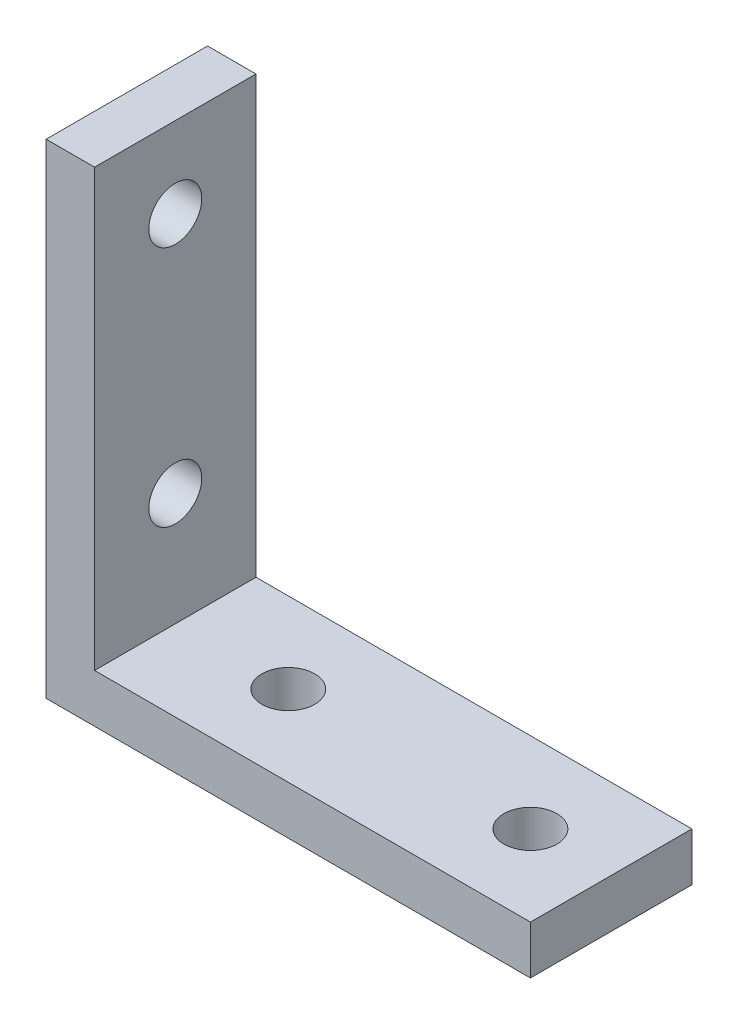
ISO-10303-21;
HEADER;
FILE_DESCRIPTION(('STEP AP214'),'2;1');
FILE_NAME('part.step','',(''),(''),'','','');
FILE_SCHEMA(('AUTOMOTIVE_DESIGN { 1 0 10303 214 1 1 1 1 }'));
ENDSEC;
DATA;
#1=APPLICATION_CONTEXT('core data for automotive mechanical design processes');
#2=APPLICATION_PROTOCOL_DEFINITION('international standard','automotive_design',2000,#1);
#3=PRODUCT_CONTEXT('',#1,'mechanical');
#4=PRODUCT('Part','Part','',(#3));
#5=PRODUCT_RELATED_PRODUCT_CATEGORY('part','',(#4));
#6=PRODUCT_DEFINITION_FORMATION('','',#4);
#7=PRODUCT_DEFINITION_CONTEXT('part definition',#1,'design');
#8=PRODUCT_DEFINITION('design','',#6,#7);
#9=PRODUCT_DEFINITION_SHAPE('','',#8);
#10=(LENGTH_UNIT() NAMED_UNIT(*) SI_UNIT(.MILLI.,.METRE.));
#11=(NAMED_UNIT(*) PLANE_ANGLE_UNIT() SI_UNIT($,.RADIAN.));
#12=(NAMED_UNIT(*) SI_UNIT($,.STERADIAN.) SOLID_ANGLE_UNIT());
#13=UNCERTAINTY_MEASURE_WITH_UNIT(LENGTH_MEASURE(1.E-05),#10,'distance_accuracy_value','');
#14=(GEOMETRIC_REPRESENTATION_CONTEXT(3) GLOBAL_UNCERTAINTY_ASSIGNED_CONTEXT((#13)) GLOBAL_UNIT_ASSIGNED_CONTEXT((#10,
#11,#12)) REPRESENTATION_CONTEXT('',''));
#15=CARTESIAN_POINT('',(0.,0.,0.));
#16=DIRECTION('',(0.,0.,1.));
#17=DIRECTION('',(1.,0.,0.));
#18=AXIS2_PLACEMENT_3D('',#15,#16,#17);
#19=CARTESIAN_POINT('',(0.,3.81,0.));
#20=DIRECTION('',(0.,-1.,0.));
#21=DIRECTION('',(0.,0.,-1.));
#22=AXIS2_PLACEMENT_3D('',#19,#20,#21);
#23=PLANE('',#22);
#24=DIRECTION('',(-1.,0.,0.));
#25=VECTOR('',#24,1.);
#26=CARTESIAN_POINT('',(0.,3.81,-12.7));
#27=LINE('',#26,#25);
#28=CARTESIAN_POINT('',(38.1,3.81,-12.7));
#29=VERTEX_POINT('',#28);
#30=CARTESIAN_POINT('',(3.81,3.81,-12.7));
#31=VERTEX_POINT('',#30);
#32=EDGE_CURVE('E60',#29,#31,#27,.T.);
#33=ORIENTED_EDGE('',*,*,#32,.T.);
#34=DIRECTION('',(0.,0.,1.));
#35=VECTOR('',#34,1.);
#36=CARTESIAN_POINT('',(3.81,3.81,0.));
#37=LINE('',#36,#35);
#38=CARTESIAN_POINT('',(3.81,3.81,0.));
#39=VERTEX_POINT('',#38);
#40=EDGE_CURVE('E55',#31,#39,#37,.T.);
#41=ORIENTED_EDGE('',*,*,#40,.T.);
#42=DIRECTION('',(1.,0.,0.));
#43=VECTOR('',#42,1.);
#44=CARTESIAN_POINT('',(0.,3.81,0.));
#45=LINE('',#44,#43);
#46=CARTESIAN_POINT('',(38.1,3.81,0.));
#47=VERTEX_POINT('',#46);
#48=EDGE_CURVE('E97',#39,#47,#45,.T.);
#49=ORIENTED_EDGE('',*,*,#48,.T.);
#50=DIRECTION('',(0.,0.,-1.));
#51=VECTOR('',#50,1.);
#52=CARTESIAN_POINT('',(38.1,3.81,0.));
#53=LINE('',#52,#51);
#54=EDGE_CURVE('E146',#47,#29,#53,.T.);
#55=ORIENTED_EDGE('',*,*,#54,.T.);
#56=EDGE_LOOP('',(#33,#41,#49,#55));
#57=FACE_BOUND('',#56,.T.);
#58=CARTESIAN_POINT('',(12.7,3.81,-6.35));
#59=DIRECTION('',(0.,1.,0.));
#60=DIRECTION('',(0.,0.,1.));
#61=AXIS2_PLACEMENT_3D('',#58,#59,#60);
#62=CIRCLE('',#61,2.0828);
#63=CARTESIAN_POINT('',(12.7,3.81,-8.4328));
#64=VERTEX_POINT('',#63);
#65=EDGE_CURVE('E136',#64,#64,#62,.T.);
#66=ORIENTED_EDGE('',*,*,#65,.F.);
#67=EDGE_LOOP('',(#66));
#68=FACE_BOUND('',#67,.T.);
#69=CARTESIAN_POINT('',(31.75,3.81,-6.35));
#70=DIRECTION('',(0.,1.,0.));
#71=DIRECTION('',(0.,0.,1.));
#72=AXIS2_PLACEMENT_3D('',#69,#70,#71);
#73=CIRCLE('',#72,2.0828);
#74=CARTESIAN_POINT('',(31.75,3.81,-8.4328));
#75=VERTEX_POINT('',#74);
#76=EDGE_CURVE('E128',#75,#75,#73,.T.);
#77=ORIENTED_EDGE('',*,*,#76,.F.);
#78=EDGE_LOOP('',(#77));
#79=FACE_BOUND('',#78,.T.);
#80=ADVANCED_FACE('F39',(#57,#68,#79),#23,.F.);
#81=CARTESIAN_POINT('',(0.,0.,0.));
#82=DIRECTION('',(0.,-1.,0.));
#83=DIRECTION('',(0.,0.,-1.));
#84=AXIS2_PLACEMENT_3D('',#81,#82,#83);
#85=PLANE('',#84);
#86=DIRECTION('',(0.,0.,-1.));
#87=VECTOR('',#86,1.);
#88=CARTESIAN_POINT('',(38.1,0.,0.));
#89=LINE('',#88,#87);
#90=CARTESIAN_POINT('',(38.1,0.,0.));
#91=VERTEX_POINT('',#90);
#92=CARTESIAN_POINT('',(38.1,0.,-12.7));
#93=VERTEX_POINT('',#92);
#94=EDGE_CURVE('E159',#91,#93,#89,.T.);
#95=ORIENTED_EDGE('',*,*,#94,.F.);
#96=DIRECTION('',(1.,0.,0.));
#97=VECTOR('',#96,1.);
#98=CARTESIAN_POINT('',(0.,0.,0.));
#99=LINE('',#98,#97);
#100=CARTESIAN_POINT('',(0.,0.,0.));
#101=VERTEX_POINT('',#100);
#102=EDGE_CURVE('E156',#101,#91,#99,.T.);
#103=ORIENTED_EDGE('',*,*,#102,.F.);
#104=DIRECTION('',(0.,0.,1.));
#105=VECTOR('',#104,1.);
#106=CARTESIAN_POINT('',(0.,0.,0.));
#107=LINE('',#106,#105);
#108=CARTESIAN_POINT('',(0.,0.,-12.7));
#109=VERTEX_POINT('',#108);
#110=EDGE_CURVE('E140',#109,#101,#107,.T.);
#111=ORIENTED_EDGE('',*,*,#110,.F.);
#112=DIRECTION('',(-1.,0.,0.));
#113=VECTOR('',#112,1.);
#114=CARTESIAN_POINT('',(0.,0.,-12.7));
#115=LINE('',#114,#113);
#116=EDGE_CURVE('E147',#93,#109,#115,.T.);
#117=ORIENTED_EDGE('',*,*,#116,.F.);
#118=EDGE_LOOP('',(#95,#103,#111,#117));
#119=FACE_BOUND('',#118,.T.);
#120=CARTESIAN_POINT('',(12.7,0.,-6.35));
#121=DIRECTION('',(0.,1.,0.));
#122=DIRECTION('',(0.,0.,1.));
#123=AXIS2_PLACEMENT_3D('',#120,#121,#122);
#124=CIRCLE('',#123,2.0828);
#125=CARTESIAN_POINT('',(12.7,0.,-8.4328));
#126=VERTEX_POINT('',#125);
#127=EDGE_CURVE('E132',#126,#126,#124,.T.);
#128=ORIENTED_EDGE('',*,*,#127,.T.);
#129=EDGE_LOOP('',(#128));
#130=FACE_BOUND('',#129,.T.);
#131=CARTESIAN_POINT('',(31.75,0.,-6.35));
#132=DIRECTION('',(0.,1.,0.));
#133=DIRECTION('',(0.,0.,1.));
#134=AXIS2_PLACEMENT_3D('',#131,#132,#133);
#135=CIRCLE('',#134,2.0828);
#136=CARTESIAN_POINT('',(31.75,0.,-8.4328));
#137=VERTEX_POINT('',#136);
#138=EDGE_CURVE('E127',#137,#137,#135,.T.);
#139=ORIENTED_EDGE('',*,*,#138,.T.);
#140=EDGE_LOOP('',(#139));
#141=FACE_BOUND('',#140,.T.);
#142=ADVANCED_FACE('F179',(#119,#130,#141),#85,.T.);
#143=CARTESIAN_POINT('',(0.,3.81,0.));
#144=DIRECTION('',(1.,0.,0.));
#145=DIRECTION('',(0.,0.,-1.));
#146=AXIS2_PLACEMENT_3D('',#143,#144,#145);
#147=PLANE('',#146);
#148=ORIENTED_EDGE('',*,*,#110,.T.);
#149=DIRECTION('',(0.,-1.,0.));
#150=VECTOR('',#149,1.);
#151=CARTESIAN_POINT('',(0.,3.81,0.));
#152=LINE('',#151,#150);
#153=CARTESIAN_POINT('',(0.,38.1,0.));
#154=VERTEX_POINT('',#153);
#155=EDGE_CURVE('E11',#154,#101,#152,.T.);
#156=ORIENTED_EDGE('',*,*,#155,.F.);
#157=DIRECTION('',(0.,0.,-1.));
#158=VECTOR('',#157,1.);
#159=CARTESIAN_POINT('',(0.,38.1,-12.7));
#160=LINE('',#159,#158);
#161=CARTESIAN_POINT('',(0.,38.1,-12.7));
#162=VERTEX_POINT('',#161);
#163=EDGE_CURVE('E109',#154,#162,#160,.T.);
#164=ORIENTED_EDGE('',*,*,#163,.T.);
#165=DIRECTION('',(0.,-1.,0.));
#166=VECTOR('',#165,1.);
#167=CARTESIAN_POINT('',(0.,3.81,-12.7));
#168=LINE('',#167,#166);
#169=EDGE_CURVE('E152',#162,#109,#168,.T.);
#170=ORIENTED_EDGE('',*,*,#169,.T.);
#171=EDGE_LOOP('',(#148,#156,#164,#170));
#172=FACE_BOUND('',#171,.T.);
#173=CARTESIAN_POINT('',(0.,12.7,-6.35));
#174=DIRECTION('',(-1.,0.,0.));
#175=DIRECTION('',(0.,0.,1.));
#176=AXIS2_PLACEMENT_3D('',#173,#174,#175);
#177=CIRCLE('',#176,2.0828);
#178=CARTESIAN_POINT('',(0.,12.7,-4.2672));
#179=VERTEX_POINT('',#178);
#180=EDGE_CURVE('E190',#179,#179,#177,.T.);
#181=ORIENTED_EDGE('',*,*,#180,.F.);
#182=EDGE_LOOP('',(#181));
#183=FACE_BOUND('',#182,.T.);
#184=CARTESIAN_POINT('',(0.,31.75,-6.35));
#185=DIRECTION('',(-1.,0.,0.));
#186=DIRECTION('',(0.,0.,1.));
#187=AXIS2_PLACEMENT_3D('',#184,#185,#186);
#188=CIRCLE('',#187,2.0828);
#189=CARTESIAN_POINT('',(0.,31.75,-4.2672));
#190=VERTEX_POINT('',#189);
#191=EDGE_CURVE('E193',#190,#190,#188,.T.);
#192=ORIENTED_EDGE('',*,*,#191,.F.);
#193=EDGE_LOOP('',(#192));
#194=FACE_BOUND('',#193,.T.);
#195=ADVANCED_FACE('F41',(#172,#183,#194),#147,.F.);
#196=CARTESIAN_POINT('',(0.,3.81,0.));
#197=DIRECTION('',(0.,0.,-1.));
#198=DIRECTION('',(-1.,0.,0.));
#199=AXIS2_PLACEMENT_3D('',#196,#197,#198);
#200=PLANE('',#199);
#201=ORIENTED_EDGE('',*,*,#48,.F.);
#202=DIRECTION('',(0.,1.,0.));
#203=VECTOR('',#202,1.);
#204=CARTESIAN_POINT('',(3.81,0.,0.));
#205=LINE('',#204,#203);
#206=CARTESIAN_POINT('',(3.81,38.1,0.));
#207=VERTEX_POINT('',#206);
#208=EDGE_CURVE('E91',#39,#207,#205,.T.);
#209=ORIENTED_EDGE('',*,*,#208,.T.);
#210=DIRECTION('',(-1.,0.,0.));
#211=VECTOR('',#210,1.);
#212=CARTESIAN_POINT('',(3.81,38.1,0.));
#213=LINE('',#212,#211);
#214=EDGE_CURVE('E94',#207,#154,#213,.T.);
#215=ORIENTED_EDGE('',*,*,#214,.T.);
#216=ORIENTED_EDGE('',*,*,#155,.T.);
#217=ORIENTED_EDGE('',*,*,#102,.T.);
#218=DIRECTION('',(0.,-1.,0.));
#219=VECTOR('',#218,1.);
#220=CARTESIAN_POINT('',(38.1,3.81,0.));
#221=LINE('',#220,#219);
#222=EDGE_CURVE('E48',#47,#91,#221,.T.);
#223=ORIENTED_EDGE('',*,*,#222,.F.);
#224=EDGE_LOOP('',(#201,#209,#215,#216,#217,#223));
#225=FACE_BOUND('',#224,.T.);
#226=ADVANCED_FACE('F93',(#225),#200,.F.);
#227=CARTESIAN_POINT('',(38.1,3.81,0.));
#228=DIRECTION('',(-1.,0.,0.));
#229=DIRECTION('',(0.,0.,1.));
#230=AXIS2_PLACEMENT_3D('',#227,#228,#229);
#231=PLANE('',#230);
#232=ORIENTED_EDGE('',*,*,#94,.T.);
#233=DIRECTION('',(0.,-1.,0.));
#234=VECTOR('',#233,1.);
#235=CARTESIAN_POINT('',(38.1,3.81,-12.7));
#236=LINE('',#235,#234);
#237=EDGE_CURVE('E167',#29,#93,#236,.T.);
#238=ORIENTED_EDGE('',*,*,#237,.F.);
#239=ORIENTED_EDGE('',*,*,#54,.F.);
#240=ORIENTED_EDGE('',*,*,#222,.T.);
#241=EDGE_LOOP('',(#232,#238,#239,#240));
#242=FACE_BOUND('',#241,.T.);
#243=ADVANCED_FACE('F175',(#242),#231,.F.);
#244=CARTESIAN_POINT('',(0.,3.81,-12.7));
#245=DIRECTION('',(0.,0.,1.));
#246=DIRECTION('',(1.,0.,0.));
#247=AXIS2_PLACEMENT_3D('',#244,#245,#246);
#248=PLANE('',#247);
#249=ORIENTED_EDGE('',*,*,#116,.T.);
#250=ORIENTED_EDGE('',*,*,#169,.F.);
#251=DIRECTION('',(-1.,0.,0.));
#252=VECTOR('',#251,1.);
#253=CARTESIAN_POINT('',(3.81,38.1,-12.7));
#254=LINE('',#253,#252);
#255=CARTESIAN_POINT('',(3.81,38.1,-12.7));
#256=VERTEX_POINT('',#255);
#257=EDGE_CURVE('E111',#256,#162,#254,.T.);
#258=ORIENTED_EDGE('',*,*,#257,.F.);
#259=DIRECTION('',(0.,-1.,0.));
#260=VECTOR('',#259,1.);
#261=CARTESIAN_POINT('',(3.81,0.,-12.7));
#262=LINE('',#261,#260);
#263=EDGE_CURVE('E102',#256,#31,#262,.T.);
#264=ORIENTED_EDGE('',*,*,#263,.T.);
#265=ORIENTED_EDGE('',*,*,#32,.F.);
#266=ORIENTED_EDGE('',*,*,#237,.T.);
#267=EDGE_LOOP('',(#249,#250,#258,#264,#265,#266));
#268=FACE_BOUND('',#267,.T.);
#269=ADVANCED_FACE('F183',(#268),#248,.F.);
#270=CARTESIAN_POINT('',(12.7,3.81,-6.35));
#271=DIRECTION('',(0.,-1.,0.));
#272=DIRECTION('',(0.,0.,-1.));
#273=AXIS2_PLACEMENT_3D('',#270,#271,#272);
#274=CYLINDRICAL_SURFACE('',#273,2.0828);
#275=CARTESIAN_POINT('',(12.7,3.81,-8.4328));
#276=CARTESIAN_POINT('',(12.7,3.7703125,-8.4328));
#277=CARTESIAN_POINT('',(12.7,3.730625,-8.4328));
#278=CARTESIAN_POINT('',(12.7,3.65125,-8.4328));
#279=CARTESIAN_POINT('',(12.7,3.6115625,-8.4328));
#280=CARTESIAN_POINT('',(12.7,3.5321875,-8.4328));
#281=CARTESIAN_POINT('',(12.7,3.4925,-8.4328));
#282=CARTESIAN_POINT('',(12.7,3.413125,-8.4328));
#283=CARTESIAN_POINT('',(12.7,3.3734375,-8.4328));
#284=CARTESIAN_POINT('',(12.7,3.2940625,-8.4328));
#285=CARTESIAN_POINT('',(12.7,3.254375,-8.4328));
#286=CARTESIAN_POINT('',(12.7,3.175,-8.4328));
#287=CARTESIAN_POINT('',(12.7,3.1353125,-8.4328));
#288=CARTESIAN_POINT('',(12.7,3.0559375,-8.4328));
#289=CARTESIAN_POINT('',(12.7,3.01625,-8.4328));
#290=CARTESIAN_POINT('',(12.7,2.936875,-8.4328));
#291=CARTESIAN_POINT('',(12.7,2.8971875,-8.4328));
#292=CARTESIAN_POINT('',(12.7,2.8178125,-8.4328));
#293=CARTESIAN_POINT('',(12.7,2.778125,-8.4328));
#294=CARTESIAN_POINT('',(12.7,2.69875,-8.4328));
#295=CARTESIAN_POINT('',(12.7,2.6590625,-8.4328));
#296=CARTESIAN_POINT('',(12.7,2.5796875,-8.4328));
#297=CARTESIAN_POINT('',(12.7,2.54,-8.4328));
#298=CARTESIAN_POINT('',(12.7,2.460625,-8.4328));
#299=CARTESIAN_POINT('',(12.7,2.4209375,-8.4328));
#300=CARTESIAN_POINT('',(12.7,2.3415625,-8.4328));
#301=CARTESIAN_POINT('',(12.7,2.301875,-8.4328));
#302=CARTESIAN_POINT('',(12.7,2.2225,-8.4328));
#303=CARTESIAN_POINT('',(12.7,2.1828125,-8.4328));
#304=CARTESIAN_POINT('',(12.7,2.1034375,-8.4328));
#305=CARTESIAN_POINT('',(12.7,2.06375,-8.4328));
#306=CARTESIAN_POINT('',(12.7,1.984375,-8.4328));
#307=CARTESIAN_POINT('',(12.7,1.9446875,-8.4328));
#308=CARTESIAN_POINT('',(12.7,1.8653125,-8.4328));
#309=CARTESIAN_POINT('',(12.7,1.825625,-8.4328));
#310=CARTESIAN_POINT('',(12.7,1.74625,-8.4328));
#311=CARTESIAN_POINT('',(12.7,1.7065625,-8.4328));
#312=CARTESIAN_POINT('',(12.7,1.6271875,-8.4328));
#313=CARTESIAN_POINT('',(12.7,1.5875,-8.4328));
#314=CARTESIAN_POINT('',(12.7,1.508125,-8.4328));
#315=CARTESIAN_POINT('',(12.7,1.4684375,-8.4328));
#316=CARTESIAN_POINT('',(12.7,1.3890625,-8.4328));
#317=CARTESIAN_POINT('',(12.7,1.349375,-8.4328));
#318=CARTESIAN_POINT('',(12.7,1.27,-8.4328));
#319=CARTESIAN_POINT('',(12.7,1.2303125,-8.4328));
#320=CARTESIAN_POINT('',(12.7,1.1509375,-8.4328));
#321=CARTESIAN_POINT('',(12.7,1.11125,-8.4328));
#322=CARTESIAN_POINT('',(12.7,1.031875,-8.4328));
#323=CARTESIAN_POINT('',(12.7,0.9921875,-8.4328));
#324=CARTESIAN_POINT('',(12.7,0.9128125,-8.4328));
#325=CARTESIAN_POINT('',(12.7,0.873125,-8.4328));
#326=CARTESIAN_POINT('',(12.7,0.79375,-8.4328));
#327=CARTESIAN_POINT('',(12.7,0.7540625,-8.4328));
#328=CARTESIAN_POINT('',(12.7,0.6746875,-8.4328));
#329=CARTESIAN_POINT('',(12.7,0.635,-8.4328));
#330=CARTESIAN_POINT('',(12.7,0.555625,-8.4328));
#331=CARTESIAN_POINT('',(12.7,0.5159375,-8.4328));
#332=CARTESIAN_POINT('',(12.7,0.4365625,-8.4328));
#333=CARTESIAN_POINT('',(12.7,0.396875,-8.4328));
#334=CARTESIAN_POINT('',(12.7,0.3175,-8.4328));
#335=CARTESIAN_POINT('',(12.7,0.2778125,-8.4328));
#336=CARTESIAN_POINT('',(12.7,0.1984375,-8.4328));
#337=CARTESIAN_POINT('',(12.7,0.15875,-8.4328));
#338=CARTESIAN_POINT('',(12.7,0.0793749999999999,-8.4328));
#339=CARTESIAN_POINT('',(12.7,0.0396874999999999,-8.4328));
#340=CARTESIAN_POINT('',(12.7,0.,-8.4328));
#341=B_SPLINE_CURVE_WITH_KNOTS('',3,(#275,#276,#277,#278,#279,#280,#281,#282,#283,#284,#285,
#286,#287,#288,#289,#290,#291,#292,#293,#294,#295,#296,#297,#298,#299,#300,#301,#302,#303,#304,
#305,#306,#307,#308,#309,#310,#311,#312,#313,#314,#315,#316,#317,#318,#319,#320,#321,#322,#323,
#324,#325,#326,#327,#328,#329,#330,#331,#332,#333,#334,#335,#336,#337,#338,#339,#340),
.UNSPECIFIED.,.F.,.F.,(4,2,2,2,2,2,2,2,2,2,2,2,2,2,2,2,2,2,2,2,2,2,2,2,2,2,2,2,2,2,2,2,4),(0.,
0.1190625,0.238125,0.3571875,0.47625,0.5953125,0.714375,0.8334375,0.9525,1.0715625,1.190625,
1.3096875,1.42875,1.5478125,1.666875,1.7859375,1.905,2.0240625,2.143125,2.2621875,2.38125,
2.5003125,2.619375,2.7384375,2.8575,2.9765625,3.095625,3.2146875,3.33375,3.4528125,3.571875,
3.6909375,3.81),.UNSPECIFIED.);
#342=EDGE_CURVE('BSEAM228',#64,#126,#341,.T.);
#343=ORIENTED_EDGE('',*,*,#65,.T.);
#344=ORIENTED_EDGE('',*,*,#127,.F.);
#345=ORIENTED_EDGE('',*,*,#342,.T.);
#346=ORIENTED_EDGE('',*,*,#342,.F.);
#347=EDGE_LOOP('',(#343,#345,#344,#346));
#348=FACE_BOUND('',#347,.T.);
#349=ADVANCED_FACE('F228',(#348),#274,.F.);
#350=CARTESIAN_POINT('',(31.75,3.81,-6.35));
#351=DIRECTION('',(0.,-1.,0.));
#352=DIRECTION('',(0.,0.,-1.));
#353=AXIS2_PLACEMENT_3D('',#350,#351,#352);
#354=CYLINDRICAL_SURFACE('',#353,2.0828);
#355=CARTESIAN_POINT('',(31.75,3.81,-8.4328));
#356=CARTESIAN_POINT('',(31.75,3.7703125,-8.4328));
#357=CARTESIAN_POINT('',(31.75,3.730625,-8.4328));
#358=CARTESIAN_POINT('',(31.75,3.65125,-8.4328));
#359=CARTESIAN_POINT('',(31.75,3.6115625,-8.4328));
#360=CARTESIAN_POINT('',(31.75,3.5321875,-8.4328));
#361=CARTESIAN_POINT('',(31.75,3.4925,-8.4328));
#362=CARTESIAN_POINT('',(31.75,3.413125,-8.4328));
#363=CARTESIAN_POINT('',(31.75,3.3734375,-8.4328));
#364=CARTESIAN_POINT('',(31.75,3.2940625,-8.4328));
#365=CARTESIAN_POINT('',(31.75,3.254375,-8.4328));
#366=CARTESIAN_POINT('',(31.75,3.175,-8.4328));
#367=CARTESIAN_POINT('',(31.75,3.1353125,-8.4328));
#368=CARTESIAN_POINT('',(31.75,3.0559375,-8.4328));
#369=CARTESIAN_POINT('',(31.75,3.01625,-8.4328));
#370=CARTESIAN_POINT('',(31.75,2.936875,-8.4328));
#371=CARTESIAN_POINT('',(31.75,2.8971875,-8.4328));
#372=CARTESIAN_POINT('',(31.75,2.8178125,-8.4328));
#373=CARTESIAN_POINT('',(31.75,2.778125,-8.4328));
#374=CARTESIAN_POINT('',(31.75,2.69875,-8.4328));
#375=CARTESIAN_POINT('',(31.75,2.6590625,-8.4328));
#376=CARTESIAN_POINT('',(31.75,2.5796875,-8.4328));
#377=CARTESIAN_POINT('',(31.75,2.54,-8.4328));
#378=CARTESIAN_POINT('',(31.75,2.460625,-8.4328));
#379=CARTESIAN_POINT('',(31.75,2.4209375,-8.4328));
#380=CARTESIAN_POINT('',(31.75,2.3415625,-8.4328));
#381=CARTESIAN_POINT('',(31.75,2.301875,-8.4328));
#382=CARTESIAN_POINT('',(31.75,2.2225,-8.4328));
#383=CARTESIAN_POINT('',(31.75,2.1828125,-8.4328));
#384=CARTESIAN_POINT('',(31.75,2.1034375,-8.4328));
#385=CARTESIAN_POINT('',(31.75,2.06375,-8.4328));
#386=CARTESIAN_POINT('',(31.75,1.984375,-8.4328));
#387=CARTESIAN_POINT('',(31.75,1.9446875,-8.4328));
#388=CARTESIAN_POINT('',(31.75,1.8653125,-8.4328));
#389=CARTESIAN_POINT('',(31.75,1.825625,-8.4328));
#390=CARTESIAN_POINT('',(31.75,1.74625,-8.4328));
#391=CARTESIAN_POINT('',(31.75,1.7065625,-8.4328));
#392=CARTESIAN_POINT('',(31.75,1.6271875,-8.4328));
#393=CARTESIAN_POINT('',(31.75,1.5875,-8.4328));
#394=CARTESIAN_POINT('',(31.75,1.508125,-8.4328));
#395=CARTESIAN_POINT('',(31.75,1.4684375,-8.4328));
#396=CARTESIAN_POINT('',(31.75,1.3890625,-8.4328));
#397=CARTESIAN_POINT('',(31.75,1.349375,-8.4328));
#398=CARTESIAN_POINT('',(31.75,1.27,-8.4328));
#399=CARTESIAN_POINT('',(31.75,1.2303125,-8.4328));
#400=CARTESIAN_POINT('',(31.75,1.1509375,-8.4328));
#401=CARTESIAN_POINT('',(31.75,1.11125,-8.4328));
#402=CARTESIAN_POINT('',(31.75,1.031875,-8.4328));
#403=CARTESIAN_POINT('',(31.75,0.9921875,-8.4328));
#404=CARTESIAN_POINT('',(31.75,0.9128125,-8.4328));
#405=CARTESIAN_POINT('',(31.75,0.873125,-8.4328));
#406=CARTESIAN_POINT('',(31.75,0.79375,-8.4328));
#407=CARTESIAN_POINT('',(31.75,0.7540625,-8.4328));
#408=CARTESIAN_POINT('',(31.75,0.6746875,-8.4328));
#409=CARTESIAN_POINT('',(31.75,0.635,-8.4328));
#410=CARTESIAN_POINT('',(31.75,0.555625,-8.4328));
#411=CARTESIAN_POINT('',(31.75,0.5159375,-8.4328));
#412=CARTESIAN_POINT('',(31.75,0.4365625,-8.4328));
#413=CARTESIAN_POINT('',(31.75,0.396875,-8.4328));
#414=CARTESIAN_POINT('',(31.75,0.3175,-8.4328));
#415=CARTESIAN_POINT('',(31.75,0.2778125,-8.4328));
#416=CARTESIAN_POINT('',(31.75,0.1984375,-8.4328));
#417=CARTESIAN_POINT('',(31.75,0.15875,-8.4328));
#418=CARTESIAN_POINT('',(31.75,0.0793749999999999,-8.4328));
#419=CARTESIAN_POINT('',(31.75,0.0396874999999999,-8.4328));
#420=CARTESIAN_POINT('',(31.75,0.,-8.4328));
#421=B_SPLINE_CURVE_WITH_KNOTS('',3,(#355,#356,#357,#358,#359,#360,#361,#362,#363,#364,#365,
#366,#367,#368,#369,#370,#371,#372,#373,#374,#375,#376,#377,#378,#379,#380,#381,#382,#383,#384,
#385,#386,#387,#388,#389,#390,#391,#392,#393,#394,#395,#396,#397,#398,#399,#400,#401,#402,#403,
#404,#405,#406,#407,#408,#409,#410,#411,#412,#413,#414,#415,#416,#417,#418,#419,#420),
.UNSPECIFIED.,.F.,.F.,(4,2,2,2,2,2,2,2,2,2,2,2,2,2,2,2,2,2,2,2,2,2,2,2,2,2,2,2,2,2,2,2,4),(0.,
0.1190625,0.238125,0.3571875,0.47625,0.5953125,0.714375,0.8334375,0.9525,1.0715625,1.190625,
1.3096875,1.42875,1.5478125,1.666875,1.7859375,1.905,2.0240625,2.143125,2.2621875,2.38125,
2.5003125,2.619375,2.7384375,2.8575,2.9765625,3.095625,3.2146875,3.33375,3.4528125,3.571875,
3.6909375,3.81),.UNSPECIFIED.);
#422=EDGE_CURVE('BSEAM250',#75,#137,#421,.T.);
#423=ORIENTED_EDGE('',*,*,#76,.T.);
#424=ORIENTED_EDGE('',*,*,#138,.F.);
#425=ORIENTED_EDGE('',*,*,#422,.T.);
#426=ORIENTED_EDGE('',*,*,#422,.F.);
#427=EDGE_LOOP('',(#423,#425,#424,#426));
#428=FACE_BOUND('',#427,.T.);
#429=ADVANCED_FACE('F250',(#428),#354,.F.);
#430=CARTESIAN_POINT('',(3.81,0.,0.));
#431=DIRECTION('',(1.,0.,0.));
#432=DIRECTION('',(0.,0.,-1.));
#433=AXIS2_PLACEMENT_3D('',#430,#431,#432);
#434=PLANE('',#433);
#435=CARTESIAN_POINT('',(3.81,31.75,-6.35));
#436=DIRECTION('',(-1.,0.,0.));
#437=DIRECTION('',(0.,0.,1.));
#438=AXIS2_PLACEMENT_3D('',#435,#436,#437);
#439=CIRCLE('',#438,2.0828);
#440=CARTESIAN_POINT('',(3.81,31.75,-4.2672));
#441=VERTEX_POINT('',#440);
#442=EDGE_CURVE('E122',#441,#441,#439,.T.);
#443=ORIENTED_EDGE('',*,*,#442,.T.);
#444=EDGE_LOOP('',(#443));
#445=FACE_BOUND('',#444,.T.);
#446=CARTESIAN_POINT('',(3.81,12.7,-6.35));
#447=DIRECTION('',(-1.,0.,0.));
#448=DIRECTION('',(0.,0.,1.));
#449=AXIS2_PLACEMENT_3D('',#446,#447,#448);
#450=CIRCLE('',#449,2.0828);
#451=CARTESIAN_POINT('',(3.81,12.7,-4.2672));
#452=VERTEX_POINT('',#451);
#453=EDGE_CURVE('E196',#452,#452,#450,.T.);
#454=ORIENTED_EDGE('',*,*,#453,.T.);
#455=EDGE_LOOP('',(#454));
#456=FACE_BOUND('',#455,.T.);
#457=ORIENTED_EDGE('',*,*,#40,.F.);
#458=ORIENTED_EDGE('',*,*,#263,.F.);
#459=DIRECTION('',(0.,0.,-1.));
#460=VECTOR('',#459,1.);
#461=CARTESIAN_POINT('',(3.81,38.1,-12.7));
#462=LINE('',#461,#460);
#463=EDGE_CURVE('E101',#207,#256,#462,.T.);
#464=ORIENTED_EDGE('',*,*,#463,.F.);
#465=ORIENTED_EDGE('',*,*,#208,.F.);
#466=EDGE_LOOP('',(#457,#458,#464,#465));
#467=FACE_BOUND('',#466,.T.);
#468=ADVANCED_FACE('F114',(#445,#456,#467),#434,.T.);
#469=CARTESIAN_POINT('',(3.81,38.1,-12.7));
#470=DIRECTION('',(0.,1.,0.));
#471=DIRECTION('',(0.,0.,1.));
#472=AXIS2_PLACEMENT_3D('',#469,#470,#471);
#473=PLANE('',#472);
#474=ORIENTED_EDGE('',*,*,#163,.F.);
#475=ORIENTED_EDGE('',*,*,#214,.F.);
#476=ORIENTED_EDGE('',*,*,#463,.T.);
#477=ORIENTED_EDGE('',*,*,#257,.T.);
#478=EDGE_LOOP('',(#474,#475,#476,#477));
#479=FACE_BOUND('',#478,.T.);
#480=ADVANCED_FACE('F106',(#479),#473,.T.);
#481=CARTESIAN_POINT('',(3.81,31.75,-6.35));
#482=DIRECTION('',(-1.,0.,0.));
#483=DIRECTION('',(0.,0.,1.));
#484=AXIS2_PLACEMENT_3D('',#481,#482,#483);
#485=CYLINDRICAL_SURFACE('',#484,2.0828);
#486=CARTESIAN_POINT('',(3.81,31.75,-4.2672));
#487=CARTESIAN_POINT('',(3.7703125,31.75,-4.2672));
#488=CARTESIAN_POINT('',(3.730625,31.75,-4.2672));
#489=CARTESIAN_POINT('',(3.65125,31.75,-4.2672));
#490=CARTESIAN_POINT('',(3.6115625,31.75,-4.2672));
#491=CARTESIAN_POINT('',(3.5321875,31.75,-4.2672));
#492=CARTESIAN_POINT('',(3.4925,31.75,-4.2672));
#493=CARTESIAN_POINT('',(3.413125,31.75,-4.2672));
#494=CARTESIAN_POINT('',(3.3734375,31.75,-4.2672));
#495=CARTESIAN_POINT('',(3.2940625,31.75,-4.2672));
#496=CARTESIAN_POINT('',(3.254375,31.75,-4.2672));
#497=CARTESIAN_POINT('',(3.175,31.75,-4.2672));
#498=CARTESIAN_POINT('',(3.1353125,31.75,-4.2672));
#499=CARTESIAN_POINT('',(3.0559375,31.75,-4.2672));
#500=CARTESIAN_POINT('',(3.01625,31.75,-4.2672));
#501=CARTESIAN_POINT('',(2.936875,31.75,-4.2672));
#502=CARTESIAN_POINT('',(2.8971875,31.75,-4.2672));
#503=CARTESIAN_POINT('',(2.8178125,31.75,-4.2672));
#504=CARTESIAN_POINT('',(2.778125,31.75,-4.2672));
#505=CARTESIAN_POINT('',(2.69875,31.75,-4.2672));
#506=CARTESIAN_POINT('',(2.6590625,31.75,-4.2672));
#507=CARTESIAN_POINT('',(2.5796875,31.75,-4.2672));
#508=CARTESIAN_POINT('',(2.54,31.75,-4.2672));
#509=CARTESIAN_POINT('',(2.460625,31.75,-4.2672));
#510=CARTESIAN_POINT('',(2.4209375,31.75,-4.2672));
#511=CARTESIAN_POINT('',(2.3415625,31.75,-4.2672));
#512=CARTESIAN_POINT('',(2.301875,31.75,-4.2672));
#513=CARTESIAN_POINT('',(2.2225,31.75,-4.2672));
#514=CARTESIAN_POINT('',(2.1828125,31.75,-4.2672));
#515=CARTESIAN_POINT('',(2.1034375,31.75,-4.2672));
#516=CARTESIAN_POINT('',(2.06375,31.75,-4.2672));
#517=CARTESIAN_POINT('',(1.984375,31.75,-4.2672));
#518=CARTESIAN_POINT('',(1.9446875,31.75,-4.2672));
#519=CARTESIAN_POINT('',(1.8653125,31.75,-4.2672));
#520=CARTESIAN_POINT('',(1.825625,31.75,-4.2672));
#521=CARTESIAN_POINT('',(1.74625,31.75,-4.2672));
#522=CARTESIAN_POINT('',(1.7065625,31.75,-4.2672));
#523=CARTESIAN_POINT('',(1.6271875,31.75,-4.2672));
#524=CARTESIAN_POINT('',(1.5875,31.75,-4.2672));
#525=CARTESIAN_POINT('',(1.508125,31.75,-4.2672));
#526=CARTESIAN_POINT('',(1.4684375,31.75,-4.2672));
#527=CARTESIAN_POINT('',(1.3890625,31.75,-4.2672));
#528=CARTESIAN_POINT('',(1.349375,31.75,-4.2672));
#529=CARTESIAN_POINT('',(1.27,31.75,-4.2672));
#530=CARTESIAN_POINT('',(1.2303125,31.75,-4.2672));
#531=CARTESIAN_POINT('',(1.1509375,31.75,-4.2672));
#532=CARTESIAN_POINT('',(1.11125,31.75,-4.2672));
#533=CARTESIAN_POINT('',(1.031875,31.75,-4.2672));
#534=CARTESIAN_POINT('',(0.9921875,31.75,-4.2672));
#535=CARTESIAN_POINT('',(0.9128125,31.75,-4.2672));
#536=CARTESIAN_POINT('',(0.873125,31.75,-4.2672));
#537=CARTESIAN_POINT('',(0.79375,31.75,-4.2672));
#538=CARTESIAN_POINT('',(0.7540625,31.75,-4.2672));
#539=CARTESIAN_POINT('',(0.6746875,31.75,-4.2672));
#540=CARTESIAN_POINT('',(0.635,31.75,-4.2672));
#541=CARTESIAN_POINT('',(0.555625,31.75,-4.2672));
#542=CARTESIAN_POINT('',(0.5159375,31.75,-4.2672));
#543=CARTESIAN_POINT('',(0.4365625,31.75,-4.2672));
#544=CARTESIAN_POINT('',(0.396875,31.75,-4.2672));
#545=CARTESIAN_POINT('',(0.3175,31.75,-4.2672));
#546=CARTESIAN_POINT('',(0.2778125,31.75,-4.2672));
#547=CARTESIAN_POINT('',(0.1984375,31.75,-4.2672));
#548=CARTESIAN_POINT('',(0.15875,31.75,-4.2672));
#549=CARTESIAN_POINT('',(0.0793749999999999,31.75,-4.2672));
#550=CARTESIAN_POINT('',(0.0396874999999999,31.75,-4.2672));
#551=CARTESIAN_POINT('',(0.,31.75,-4.2672));
#552=B_SPLINE_CURVE_WITH_KNOTS('',3,(#486,#487,#488,#489,#490,#491,#492,#493,#494,#495,#496,
#497,#498,#499,#500,#501,#502,#503,#504,#505,#506,#507,#508,#509,#510,#511,#512,#513,#514,#515,
#516,#517,#518,#519,#520,#521,#522,#523,#524,#525,#526,#527,#528,#529,#530,#531,#532,#533,#534,
#535,#536,#537,#538,#539,#540,#541,#542,#543,#544,#545,#546,#547,#548,#549,#550,#551),
.UNSPECIFIED.,.F.,.F.,(4,2,2,2,2,2,2,2,2,2,2,2,2,2,2,2,2,2,2,2,2,2,2,2,2,2,2,2,2,2,2,2,4),(0.,
0.1190625,0.238125,0.3571875,0.47625,0.5953125,0.714375,0.833437499999999,0.9525,1.0715625,
1.190625,1.3096875,1.42875,1.5478125,1.666875,1.7859375,1.905,2.0240625,2.143125,2.2621875,
2.38125,2.5003125,2.619375,2.7384375,2.8575,2.9765625,3.095625,3.2146875,3.33375,3.4528125,
3.571875,3.6909375,3.81),.UNSPECIFIED.);
#553=EDGE_CURVE('BSEAM210',#441,#190,#552,.T.);
#554=ORIENTED_EDGE('',*,*,#442,.F.);
#555=ORIENTED_EDGE('',*,*,#191,.T.);
#556=ORIENTED_EDGE('',*,*,#553,.T.);
#557=ORIENTED_EDGE('',*,*,#553,.F.);
#558=EDGE_LOOP('',(#554,#556,#555,#557));
#559=FACE_BOUND('',#558,.T.);
#560=ADVANCED_FACE('F210',(#559),#485,.F.);
#561=CARTESIAN_POINT('',(3.81,12.7,-6.35));
#562=DIRECTION('',(-1.,0.,0.));
#563=DIRECTION('',(0.,0.,1.));
#564=AXIS2_PLACEMENT_3D('',#561,#562,#563);
#565=CYLINDRICAL_SURFACE('',#564,2.0828);
#566=CARTESIAN_POINT('',(3.81,12.7,-4.2672));
#567=CARTESIAN_POINT('',(3.7703125,12.7,-4.2672));
#568=CARTESIAN_POINT('',(3.730625,12.7,-4.2672));
#569=CARTESIAN_POINT('',(3.65125,12.7,-4.2672));
#570=CARTESIAN_POINT('',(3.6115625,12.7,-4.2672));
#571=CARTESIAN_POINT('',(3.5321875,12.7,-4.2672));
#572=CARTESIAN_POINT('',(3.4925,12.7,-4.2672));
#573=CARTESIAN_POINT('',(3.413125,12.7,-4.2672));
#574=CARTESIAN_POINT('',(3.3734375,12.7,-4.2672));
#575=CARTESIAN_POINT('',(3.2940625,12.7,-4.2672));
#576=CARTESIAN_POINT('',(3.254375,12.7,-4.2672));
#577=CARTESIAN_POINT('',(3.175,12.7,-4.2672));
#578=CARTESIAN_POINT('',(3.1353125,12.7,-4.2672));
#579=CARTESIAN_POINT('',(3.0559375,12.7,-4.2672));
#580=CARTESIAN_POINT('',(3.01625,12.7,-4.2672));
#581=CARTESIAN_POINT('',(2.936875,12.7,-4.2672));
#582=CARTESIAN_POINT('',(2.8971875,12.7,-4.2672));
#583=CARTESIAN_POINT('',(2.8178125,12.7,-4.2672));
#584=CARTESIAN_POINT('',(2.778125,12.7,-4.2672));
#585=CARTESIAN_POINT('',(2.69875,12.7,-4.2672));
#586=CARTESIAN_POINT('',(2.6590625,12.7,-4.2672));
#587=CARTESIAN_POINT('',(2.5796875,12.7,-4.2672));
#588=CARTESIAN_POINT('',(2.54,12.7,-4.2672));
#589=CARTESIAN_POINT('',(2.460625,12.7,-4.2672));
#590=CARTESIAN_POINT('',(2.4209375,12.7,-4.2672));
#591=CARTESIAN_POINT('',(2.3415625,12.7,-4.2672));
#592=CARTESIAN_POINT('',(2.301875,12.7,-4.2672));
#593=CARTESIAN_POINT('',(2.2225,12.7,-4.2672));
#594=CARTESIAN_POINT('',(2.1828125,12.7,-4.2672));
#595=CARTESIAN_POINT('',(2.1034375,12.7,-4.2672));
#596=CARTESIAN_POINT('',(2.06375,12.7,-4.2672));
#597=CARTESIAN_POINT('',(1.984375,12.7,-4.2672));
#598=CARTESIAN_POINT('',(1.9446875,12.7,-4.2672));
#599=CARTESIAN_POINT('',(1.8653125,12.7,-4.2672));
#600=CARTESIAN_POINT('',(1.825625,12.7,-4.2672));
#601=CARTESIAN_POINT('',(1.74625,12.7,-4.2672));
#602=CARTESIAN_POINT('',(1.7065625,12.7,-4.2672));
#603=CARTESIAN_POINT('',(1.6271875,12.7,-4.2672));
#604=CARTESIAN_POINT('',(1.5875,12.7,-4.2672));
#605=CARTESIAN_POINT('',(1.508125,12.7,-4.2672));
#606=CARTESIAN_POINT('',(1.4684375,12.7,-4.2672));
#607=CARTESIAN_POINT('',(1.3890625,12.7,-4.2672));
#608=CARTESIAN_POINT('',(1.349375,12.7,-4.2672));
#609=CARTESIAN_POINT('',(1.27,12.7,-4.2672));
#610=CARTESIAN_POINT('',(1.2303125,12.7,-4.2672));
#611=CARTESIAN_POINT('',(1.1509375,12.7,-4.2672));
#612=CARTESIAN_POINT('',(1.11125,12.7,-4.2672));
#613=CARTESIAN_POINT('',(1.031875,12.7,-4.2672));
#614=CARTESIAN_POINT('',(0.9921875,12.7,-4.2672));
#615=CARTESIAN_POINT('',(0.9128125,12.7,-4.2672));
#616=CARTESIAN_POINT('',(0.873125,12.7,-4.2672));
#617=CARTESIAN_POINT('',(0.79375,12.7,-4.2672));
#618=CARTESIAN_POINT('',(0.7540625,12.7,-4.2672));
#619=CARTESIAN_POINT('',(0.6746875,12.7,-4.2672));
#620=CARTESIAN_POINT('',(0.635,12.7,-4.2672));
#621=CARTESIAN_POINT('',(0.555625,12.7,-4.2672));
#622=CARTESIAN_POINT('',(0.5159375,12.7,-4.2672));
#623=CARTESIAN_POINT('',(0.4365625,12.7,-4.2672));
#624=CARTESIAN_POINT('',(0.396875,12.7,-4.2672));
#625=CARTESIAN_POINT('',(0.3175,12.7,-4.2672));
#626=CARTESIAN_POINT('',(0.2778125,12.7,-4.2672));
#627=CARTESIAN_POINT('',(0.1984375,12.7,-4.2672));
#628=CARTESIAN_POINT('',(0.15875,12.7,-4.2672));
#629=CARTESIAN_POINT('',(0.0793749999999999,12.7,-4.2672));
#630=CARTESIAN_POINT('',(0.0396874999999999,12.7,-4.2672));
#631=CARTESIAN_POINT('',(0.,12.7,-4.2672));
#632=B_SPLINE_CURVE_WITH_KNOTS('',3,(#566,#567,#568,#569,#570,#571,#572,#573,#574,#575,#576,
#577,#578,#579,#580,#581,#582,#583,#584,#585,#586,#587,#588,#589,#590,#591,#592,#593,#594,#595,
#596,#597,#598,#599,#600,#601,#602,#603,#604,#605,#606,#607,#608,#609,#610,#611,#612,#613,#614,
#615,#616,#617,#618,#619,#620,#621,#622,#623,#624,#625,#626,#627,#628,#629,#630,#631),
.UNSPECIFIED.,.F.,.F.,(4,2,2,2,2,2,2,2,2,2,2,2,2,2,2,2,2,2,2,2,2,2,2,2,2,2,2,2,2,2,2,2,4),(0.,
0.1190625,0.238125,0.3571875,0.47625,0.5953125,0.714375,0.833437499999999,0.9525,1.0715625,
1.190625,1.3096875,1.42875,1.5478125,1.666875,1.7859375,1.905,2.0240625,2.143125,2.2621875,
2.38125,2.5003125,2.619375,2.7384375,2.8575,2.9765625,3.095625,3.2146875,3.33375,3.4528125,
3.571875,3.6909375,3.81),.UNSPECIFIED.);
#633=EDGE_CURVE('BSEAM208',#452,#179,#632,.T.);
#634=ORIENTED_EDGE('',*,*,#453,.F.);
#635=ORIENTED_EDGE('',*,*,#180,.T.);
#636=ORIENTED_EDGE('',*,*,#633,.T.);
#637=ORIENTED_EDGE('',*,*,#633,.F.);
#638=EDGE_LOOP('',(#634,#636,#635,#637));
#639=FACE_BOUND('',#638,.T.);
#640=ADVANCED_FACE('F208',(#639),#565,.F.);
#641=CLOSED_SHELL('',(#80,#142,#195,#226,#243,#269,#349,#429,#468,#480,#560,#640));
#642=MANIFOLD_SOLID_BREP('B2',#641);
#643=ADVANCED_BREP_SHAPE_REPRESENTATION('',(#18,#642),#14);
#644=SHAPE_DEFINITION_REPRESENTATION(#9,#643);
ENDSEC;
END-ISO-10303-21;
